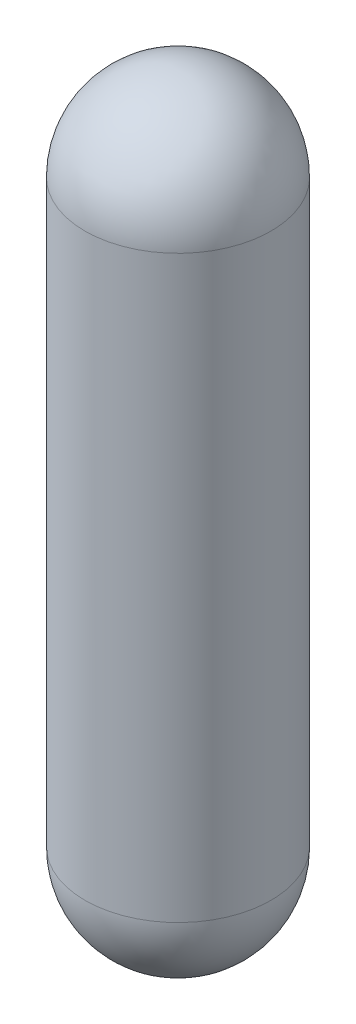
ISO-10303-21;
HEADER;
FILE_DESCRIPTION(('STEP AP214'),'2;1');
FILE_NAME('part.step','',(''),(''),'','','');
FILE_SCHEMA(('AUTOMOTIVE_DESIGN { 1 0 10303 214 1 1 1 1 }'));
ENDSEC;
DATA;
#1=APPLICATION_CONTEXT('core data for automotive mechanical design processes');
#2=APPLICATION_PROTOCOL_DEFINITION('international standard','automotive_design',2000,#1);
#3=PRODUCT_CONTEXT('',#1,'mechanical');
#4=PRODUCT('Part','Part','',(#3));
#5=PRODUCT_RELATED_PRODUCT_CATEGORY('part','',(#4));
#6=PRODUCT_DEFINITION_FORMATION('','',#4);
#7=PRODUCT_DEFINITION_CONTEXT('part definition',#1,'design');
#8=PRODUCT_DEFINITION('design','',#6,#7);
#9=PRODUCT_DEFINITION_SHAPE('','',#8);
#10=(LENGTH_UNIT() NAMED_UNIT(*) SI_UNIT(.MILLI.,.METRE.));
#11=(NAMED_UNIT(*) PLANE_ANGLE_UNIT() SI_UNIT($,.RADIAN.));
#12=(NAMED_UNIT(*) SI_UNIT($,.STERADIAN.) SOLID_ANGLE_UNIT());
#13=UNCERTAINTY_MEASURE_WITH_UNIT(LENGTH_MEASURE(1.E-05),#10,'distance_accuracy_value','');
#14=(GEOMETRIC_REPRESENTATION_CONTEXT(3) GLOBAL_UNCERTAINTY_ASSIGNED_CONTEXT((#13)) GLOBAL_UNIT_ASSIGNED_CONTEXT((#10,
#11,#12)) REPRESENTATION_CONTEXT('',''));
#15=CARTESIAN_POINT('',(0.,0.,0.));
#16=DIRECTION('',(0.,0.,1.));
#17=DIRECTION('',(1.,0.,0.));
#18=AXIS2_PLACEMENT_3D('',#15,#16,#17);
#19=CARTESIAN_POINT('',(0.,43.6,0.));
#20=DIRECTION('',(0.,-1.,0.));
#21=DIRECTION('',(0.,0.,-1.));
#22=AXIS2_PLACEMENT_3D('',#19,#20,#21);
#23=CYLINDRICAL_SURFACE('',#22,7.);
#24=CARTESIAN_POINT('',(0.,43.6,0.));
#25=DIRECTION('',(0.,1.,0.));
#26=DIRECTION('',(0.,0.,1.));
#27=AXIS2_PLACEMENT_3D('',#24,#25,#26);
#28=CIRCLE('',#27,7.);
#29=CARTESIAN_POINT('',(0.,43.6,7.));
#30=VERTEX_POINT('',#29);
#31=EDGE_CURVE('E10',#30,#30,#28,.T.);
#32=ORIENTED_EDGE('',*,*,#31,.F.);
#33=EDGE_LOOP('',(#32));
#34=FACE_BOUND('',#33,.T.);
#35=CARTESIAN_POINT('',(0.,0.,0.));
#36=DIRECTION('',(0.,1.,0.));
#37=DIRECTION('',(0.118561990445367,0.,0.992946652354311));
#38=AXIS2_PLACEMENT_3D('',#35,#36,#37);
#39=CIRCLE('',#38,7.);
#40=CARTESIAN_POINT('',(0.829933933117516,0.,6.95062656648018));
#41=VERTEX_POINT('',#40);
#42=EDGE_CURVE('E39',#41,#41,#39,.T.);
#43=ORIENTED_EDGE('',*,*,#42,.T.);
#44=EDGE_LOOP('',(#43));
#45=FACE_BOUND('',#44,.T.);
#46=ADVANCED_FACE('F33',(#34,#45),#23,.T.);
#47=CARTESIAN_POINT('',(0.,0.,0.));
#48=DIRECTION('',(0.0593858048934637,0.,0.998235105662567));
#49=DIRECTION('',(0.998235105662567,0.,-0.0593858048934637));
#50=AXIS2_PLACEMENT_3D('',#47,#48,#49);
#51=SPHERICAL_SURFACE('',#50,7.);
#52=CARTESIAN_POINT('',(0.,0.,0.));
#53=DIRECTION('',(0.,1.,0.));
#54=DIRECTION('',(0.118561990445366,0.,0.992946652354311));
#55=AXIS2_PLACEMENT_3D('',#52,#53,#54);
#56=SPHERICAL_SURFACE('',#55,7.);
#57=ORIENTED_EDGE('',*,*,#42,.F.);
#58=EDGE_LOOP('',(#57));
#59=FACE_BOUND('',#58,.T.);
#60=ADVANCED_FACE('F46',(#59),#56,.T.);
#61=CARTESIAN_POINT('',(0.,43.6,0.));
#62=DIRECTION('',(1.,0.,0.));
#63=DIRECTION('',(0.,0.,-1.));
#64=AXIS2_PLACEMENT_3D('',#61,#62,#63);
#65=SPHERICAL_SURFACE('',#64,7.);
#66=CARTESIAN_POINT('',(0.,43.6,0.));
#67=DIRECTION('',(0.,1.,0.));
#68=DIRECTION('',(0.,0.,1.));
#69=AXIS2_PLACEMENT_3D('',#66,#67,#68);
#70=SPHERICAL_SURFACE('',#69,7.);
#71=ORIENTED_EDGE('',*,*,#31,.T.);
#72=EDGE_LOOP('',(#71));
#73=FACE_BOUND('',#72,.T.);
#74=ADVANCED_FACE('F48',(#73),#70,.T.);
#75=CLOSED_SHELL('',(#46,#60,#74));
#76=MANIFOLD_SOLID_BREP('B2',#75);
#77=ADVANCED_BREP_SHAPE_REPRESENTATION('',(#18,#76),#14);
#78=SHAPE_DEFINITION_REPRESENTATION(#9,#77);
ENDSEC;
END-ISO-10303-21;
